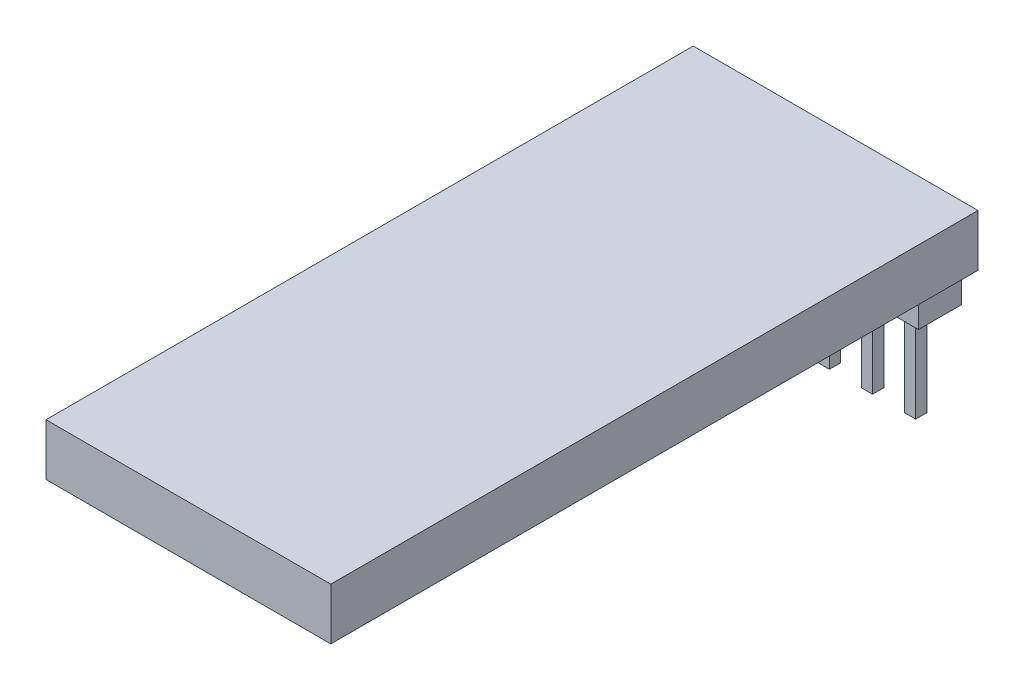
ISO-10303-21;
HEADER;
FILE_DESCRIPTION(('STEP AP214'),'2;1');
FILE_NAME('part.step','',(''),(''),'','','');
FILE_SCHEMA(('AUTOMOTIVE_DESIGN { 1 0 10303 214 1 1 1 1 }'));
ENDSEC;
DATA;
#1=APPLICATION_CONTEXT('core data for automotive mechanical design processes');
#2=APPLICATION_PROTOCOL_DEFINITION('international standard','automotive_design',2000,#1);
#3=PRODUCT_CONTEXT('',#1,'mechanical');
#4=PRODUCT('Part','Part','',(#3));
#5=PRODUCT_RELATED_PRODUCT_CATEGORY('part','',(#4));
#6=PRODUCT_DEFINITION_FORMATION('','',#4);
#7=PRODUCT_DEFINITION_CONTEXT('part definition',#1,'design');
#8=PRODUCT_DEFINITION('design','',#6,#7);
#9=PRODUCT_DEFINITION_SHAPE('','',#8);
#10=(LENGTH_UNIT() NAMED_UNIT(*) SI_UNIT(.MILLI.,.METRE.));
#11=(NAMED_UNIT(*) PLANE_ANGLE_UNIT() SI_UNIT($,.RADIAN.));
#12=(NAMED_UNIT(*) SI_UNIT($,.STERADIAN.) SOLID_ANGLE_UNIT());
#13=UNCERTAINTY_MEASURE_WITH_UNIT(LENGTH_MEASURE(1.E-05),#10,'distance_accuracy_value','');
#14=(GEOMETRIC_REPRESENTATION_CONTEXT(3) GLOBAL_UNCERTAINTY_ASSIGNED_CONTEXT((#13)) GLOBAL_UNIT_ASSIGNED_CONTEXT((#10,
#11,#12)) REPRESENTATION_CONTEXT('',''));
#15=CARTESIAN_POINT('',(0.,0.,0.));
#16=DIRECTION('',(0.,0.,1.));
#17=DIRECTION('',(1.,0.,0.));
#18=AXIS2_PLACEMENT_3D('',#15,#16,#17);
#19=CARTESIAN_POINT('',(0.765,-6.25,-17.3));
#20=DIRECTION('',(-1.,0.,0.));
#21=DIRECTION('',(0.,0.,1.));
#22=AXIS2_PLACEMENT_3D('',#19,#20,#21);
#23=PLANE('',#22);
#24=DIRECTION('',(0.,0.,-1.));
#25=VECTOR('',#24,1.);
#26=CARTESIAN_POINT('',(0.765,-3.5,-16.975));
#27=LINE('',#26,#25);
#28=CARTESIAN_POINT('',(0.765,-3.5,-16.975));
#29=VERTEX_POINT('',#28);
#30=CARTESIAN_POINT('',(0.765,-3.5,-17.625));
#31=VERTEX_POINT('',#30);
#32=EDGE_CURVE('P0_E252',#29,#31,#27,.T.);
#33=ORIENTED_EDGE('',*,*,#32,.T.);
#34=DIRECTION('',(0.,-1.,0.));
#35=VECTOR('',#34,1.);
#36=CARTESIAN_POINT('',(0.765,-3.5,-17.625));
#37=LINE('',#36,#35);
#38=CARTESIAN_POINT('',(0.765,-9.,-17.625));
#39=VERTEX_POINT('',#38);
#40=EDGE_CURVE('P0_E76',#31,#39,#37,.T.);
#41=ORIENTED_EDGE('',*,*,#40,.T.);
#42=DIRECTION('',(0.,0.,-1.));
#43=VECTOR('',#42,1.);
#44=CARTESIAN_POINT('',(0.765,-9.,-16.975));
#45=LINE('',#44,#43);
#46=CARTESIAN_POINT('',(0.765,-9.,-16.975));
#47=VERTEX_POINT('',#46);
#48=EDGE_CURVE('P0_E80',#47,#39,#45,.T.);
#49=ORIENTED_EDGE('',*,*,#48,.F.);
#50=DIRECTION('',(0.,-1.,0.));
#51=VECTOR('',#50,1.);
#52=CARTESIAN_POINT('',(0.765,-3.5,-16.975));
#53=LINE('',#52,#51);
#54=EDGE_CURVE('P0_E11',#29,#47,#53,.T.);
#55=ORIENTED_EDGE('',*,*,#54,.F.);
#56=EDGE_LOOP('',(#33,#41,#49,#55));
#57=FACE_BOUND('',#56,.T.);
#58=ADVANCED_FACE('P0_F16',(#57),#23,.T.);
#59=CARTESIAN_POINT('',(1.09,-6.25,-16.975));
#60=DIRECTION('',(0.,0.,1.));
#61=DIRECTION('',(1.,0.,0.));
#62=AXIS2_PLACEMENT_3D('',#59,#60,#61);
#63=PLANE('',#62);
#64=DIRECTION('',(-1.,0.,0.));
#65=VECTOR('',#64,1.);
#66=CARTESIAN_POINT('',(1.415,-3.5,-16.975));
#67=LINE('',#66,#65);
#68=CARTESIAN_POINT('',(1.415,-3.5,-16.975));
#69=VERTEX_POINT('',#68);
#70=EDGE_CURVE('P0_E247',#69,#29,#67,.T.);
#71=ORIENTED_EDGE('',*,*,#70,.T.);
#72=ORIENTED_EDGE('',*,*,#54,.T.);
#73=DIRECTION('',(-1.,0.,0.));
#74=VECTOR('',#73,1.);
#75=CARTESIAN_POINT('',(1.415,-9.,-16.975));
#76=LINE('',#75,#74);
#77=CARTESIAN_POINT('',(1.415,-9.,-16.975));
#78=VERTEX_POINT('',#77);
#79=EDGE_CURVE('P0_E84',#78,#47,#76,.T.);
#80=ORIENTED_EDGE('',*,*,#79,.F.);
#81=DIRECTION('',(0.,-1.,0.));
#82=VECTOR('',#81,1.);
#83=CARTESIAN_POINT('',(1.415,-3.5,-16.975));
#84=LINE('',#83,#82);
#85=EDGE_CURVE('P0_E20',#69,#78,#84,.T.);
#86=ORIENTED_EDGE('',*,*,#85,.F.);
#87=EDGE_LOOP('',(#71,#72,#80,#86));
#88=FACE_BOUND('',#87,.T.);
#89=ADVANCED_FACE('P0_F18',(#88),#63,.T.);
#90=CARTESIAN_POINT('',(1.415,-6.25,-17.3));
#91=DIRECTION('',(1.,0.,0.));
#92=DIRECTION('',(0.,1.,0.));
#93=AXIS2_PLACEMENT_3D('',#90,#91,#92);
#94=PLANE('',#93);
#95=DIRECTION('',(0.,0.,1.));
#96=VECTOR('',#95,1.);
#97=CARTESIAN_POINT('',(1.415,-3.5,-17.625));
#98=LINE('',#97,#96);
#99=CARTESIAN_POINT('',(1.415,-3.5,-17.625));
#100=VERTEX_POINT('',#99);
#101=EDGE_CURVE('P0_E94',#100,#69,#98,.T.);
#102=ORIENTED_EDGE('',*,*,#101,.T.);
#103=ORIENTED_EDGE('',*,*,#85,.T.);
#104=DIRECTION('',(0.,0.,1.));
#105=VECTOR('',#104,1.);
#106=CARTESIAN_POINT('',(1.415,-9.,-17.625));
#107=LINE('',#106,#105);
#108=CARTESIAN_POINT('',(1.415,-9.,-17.625));
#109=VERTEX_POINT('',#108);
#110=EDGE_CURVE('P0_E79',#109,#78,#107,.T.);
#111=ORIENTED_EDGE('',*,*,#110,.F.);
#112=DIRECTION('',(0.,-1.,0.));
#113=VECTOR('',#112,1.);
#114=CARTESIAN_POINT('',(1.415,-3.5,-17.625));
#115=LINE('',#114,#113);
#116=EDGE_CURVE('P0_E65',#100,#109,#115,.T.);
#117=ORIENTED_EDGE('',*,*,#116,.F.);
#118=EDGE_LOOP('',(#102,#103,#111,#117));
#119=FACE_BOUND('',#118,.T.);
#120=ADVANCED_FACE('P0_F81',(#119),#94,.T.);
#121=CARTESIAN_POINT('',(1.09,-6.25,-17.625));
#122=DIRECTION('',(0.,0.,-1.));
#123=DIRECTION('',(0.,-1.,0.));
#124=AXIS2_PLACEMENT_3D('',#121,#122,#123);
#125=PLANE('',#124);
#126=DIRECTION('',(1.,0.,0.));
#127=VECTOR('',#126,1.);
#128=CARTESIAN_POINT('',(0.765,-3.5,-17.625));
#129=LINE('',#128,#127);
#130=EDGE_CURVE('P0_E75',#31,#100,#129,.T.);
#131=ORIENTED_EDGE('',*,*,#130,.T.);
#132=ORIENTED_EDGE('',*,*,#116,.T.);
#133=DIRECTION('',(1.,0.,0.));
#134=VECTOR('',#133,1.);
#135=CARTESIAN_POINT('',(0.765,-9.,-17.625));
#136=LINE('',#135,#134);
#137=EDGE_CURVE('P0_E67',#39,#109,#136,.T.);
#138=ORIENTED_EDGE('',*,*,#137,.F.);
#139=ORIENTED_EDGE('',*,*,#40,.F.);
#140=EDGE_LOOP('',(#131,#132,#138,#139));
#141=FACE_BOUND('',#140,.T.);
#142=ADVANCED_FACE('P0_F70',(#141),#125,.T.);
#143=CARTESIAN_POINT('',(1.09,-9.,-17.3));
#144=DIRECTION('',(0.,-1.,0.));
#145=DIRECTION('',(0.,0.,-1.));
#146=AXIS2_PLACEMENT_3D('',#143,#144,#145);
#147=PLANE('',#146);
#148=ORIENTED_EDGE('',*,*,#137,.T.);
#149=ORIENTED_EDGE('',*,*,#110,.T.);
#150=ORIENTED_EDGE('',*,*,#79,.T.);
#151=ORIENTED_EDGE('',*,*,#48,.T.);
#152=EDGE_LOOP('',(#148,#149,#150,#151));
#153=FACE_BOUND('',#152,.T.);
#154=ADVANCED_FACE('P0_F86',(#153),#147,.T.);
#155=CARTESIAN_POINT('',(1.09,-3.5,-17.3));
#156=DIRECTION('',(0.,-1.,0.));
#157=DIRECTION('',(0.,0.,-1.));
#158=AXIS2_PLACEMENT_3D('',#155,#156,#157);
#159=PLANE('',#158);
#160=ORIENTED_EDGE('',*,*,#32,.F.);
#161=ORIENTED_EDGE('',*,*,#70,.F.);
#162=ORIENTED_EDGE('',*,*,#101,.F.);
#163=ORIENTED_EDGE('',*,*,#130,.F.);
#164=EDGE_LOOP('',(#160,#161,#162,#163));
#165=FACE_BOUND('',#164,.T.);
#166=ADVANCED_FACE('P0_F122',(#165),#159,.F.);
#167=CLOSED_SHELL('',(#58,#89,#120,#142,#154,#166));
#168=MANIFOLD_SOLID_BREP('P0_B1',#167);
#169=CARTESIAN_POINT('',(-6.735,-6.25,-17.3));
#170=DIRECTION('',(-1.,0.,0.));
#171=DIRECTION('',(0.,0.,1.));
#172=AXIS2_PLACEMENT_3D('',#169,#170,#171);
#173=PLANE('',#172);
#174=DIRECTION('',(0.,0.,-1.));
#175=VECTOR('',#174,1.);
#176=CARTESIAN_POINT('',(-6.735,-3.5,-16.975));
#177=LINE('',#176,#175);
#178=CARTESIAN_POINT('',(-6.735,-3.5,-16.975));
#179=VERTEX_POINT('',#178);
#180=CARTESIAN_POINT('',(-6.735,-3.5,-17.625));
#181=VERTEX_POINT('',#180);
#182=EDGE_CURVE('P1_E169',#179,#181,#177,.T.);
#183=ORIENTED_EDGE('',*,*,#182,.T.);
#184=DIRECTION('',(0.,-1.,0.));
#185=VECTOR('',#184,1.);
#186=CARTESIAN_POINT('',(-6.735,-3.5,-17.625));
#187=LINE('',#186,#185);
#188=CARTESIAN_POINT('',(-6.735,-9.,-17.625));
#189=VERTEX_POINT('',#188);
#190=EDGE_CURVE('P1_E71',#181,#189,#187,.T.);
#191=ORIENTED_EDGE('',*,*,#190,.T.);
#192=DIRECTION('',(0.,0.,-1.));
#193=VECTOR('',#192,1.);
#194=CARTESIAN_POINT('',(-6.735,-9.,-16.975));
#195=LINE('',#194,#193);
#196=CARTESIAN_POINT('',(-6.735,-9.,-16.975));
#197=VERTEX_POINT('',#196);
#198=EDGE_CURVE('P1_E73',#197,#189,#195,.T.);
#199=ORIENTED_EDGE('',*,*,#198,.F.);
#200=DIRECTION('',(0.,-1.,0.));
#201=VECTOR('',#200,1.);
#202=CARTESIAN_POINT('',(-6.735,-3.5,-16.975));
#203=LINE('',#202,#201);
#204=EDGE_CURVE('P1_E11',#179,#197,#203,.T.);
#205=ORIENTED_EDGE('',*,*,#204,.F.);
#206=EDGE_LOOP('',(#183,#191,#199,#205));
#207=FACE_BOUND('',#206,.T.);
#208=ADVANCED_FACE('P1_F16',(#207),#173,.T.);
#209=CARTESIAN_POINT('',(-6.41,-6.25,-16.975));
#210=DIRECTION('',(0.,0.,1.));
#211=DIRECTION('',(1.,0.,0.));
#212=AXIS2_PLACEMENT_3D('',#209,#210,#211);
#213=PLANE('',#212);
#214=DIRECTION('',(-1.,0.,0.));
#215=VECTOR('',#214,1.);
#216=CARTESIAN_POINT('',(-6.085,-3.5,-16.975));
#217=LINE('',#216,#215);
#218=CARTESIAN_POINT('',(-6.085,-3.5,-16.975));
#219=VERTEX_POINT('',#218);
#220=EDGE_CURVE('P1_E168',#219,#179,#217,.T.);
#221=ORIENTED_EDGE('',*,*,#220,.T.);
#222=ORIENTED_EDGE('',*,*,#204,.T.);
#223=DIRECTION('',(-1.,0.,0.));
#224=VECTOR('',#223,1.);
#225=CARTESIAN_POINT('',(-6.085,-9.,-16.975));
#226=LINE('',#225,#224);
#227=CARTESIAN_POINT('',(-6.085,-9.,-16.975));
#228=VERTEX_POINT('',#227);
#229=EDGE_CURVE('P1_E81',#228,#197,#226,.T.);
#230=ORIENTED_EDGE('',*,*,#229,.F.);
#231=DIRECTION('',(0.,-1.,0.));
#232=VECTOR('',#231,1.);
#233=CARTESIAN_POINT('',(-6.085,-3.5,-16.975));
#234=LINE('',#233,#232);
#235=EDGE_CURVE('P1_E25',#219,#228,#234,.T.);
#236=ORIENTED_EDGE('',*,*,#235,.F.);
#237=EDGE_LOOP('',(#221,#222,#230,#236));
#238=FACE_BOUND('',#237,.T.);
#239=ADVANCED_FACE('P1_F139',(#238),#213,.T.);
#240=CARTESIAN_POINT('',(-6.085,-6.25,-17.3));
#241=DIRECTION('',(1.,0.,0.));
#242=DIRECTION('',(0.,1.,0.));
#243=AXIS2_PLACEMENT_3D('',#240,#241,#242);
#244=PLANE('',#243);
#245=DIRECTION('',(0.,0.,1.));
#246=VECTOR('',#245,1.);
#247=CARTESIAN_POINT('',(-6.085,-3.5,-17.625));
#248=LINE('',#247,#246);
#249=CARTESIAN_POINT('',(-6.085,-3.5,-17.625));
#250=VERTEX_POINT('',#249);
#251=EDGE_CURVE('P1_E90',#250,#219,#248,.T.);
#252=ORIENTED_EDGE('',*,*,#251,.T.);
#253=ORIENTED_EDGE('',*,*,#235,.T.);
#254=DIRECTION('',(0.,0.,1.));
#255=VECTOR('',#254,1.);
#256=CARTESIAN_POINT('',(-6.085,-9.,-17.625));
#257=LINE('',#256,#255);
#258=CARTESIAN_POINT('',(-6.085,-9.,-17.625));
#259=VERTEX_POINT('',#258);
#260=EDGE_CURVE('P1_E76',#259,#228,#257,.T.);
#261=ORIENTED_EDGE('',*,*,#260,.F.);
#262=DIRECTION('',(0.,-1.,0.));
#263=VECTOR('',#262,1.);
#264=CARTESIAN_POINT('',(-6.085,-3.5,-17.625));
#265=LINE('',#264,#263);
#266=EDGE_CURVE('P1_E58',#250,#259,#265,.T.);
#267=ORIENTED_EDGE('',*,*,#266,.F.);
#268=EDGE_LOOP('',(#252,#253,#261,#267));
#269=FACE_BOUND('',#268,.T.);
#270=ADVANCED_FACE('P1_F80',(#269),#244,.T.);
#271=CARTESIAN_POINT('',(-6.41,-6.25,-17.625));
#272=DIRECTION('',(0.,0.,-1.));
#273=DIRECTION('',(0.,-1.,0.));
#274=AXIS2_PLACEMENT_3D('',#271,#272,#273);
#275=PLANE('',#274);
#276=DIRECTION('',(1.,0.,0.));
#277=VECTOR('',#276,1.);
#278=CARTESIAN_POINT('',(-6.735,-3.5,-17.625));
#279=LINE('',#278,#277);
#280=EDGE_CURVE('P1_E70',#181,#250,#279,.T.);
#281=ORIENTED_EDGE('',*,*,#280,.T.);
#282=ORIENTED_EDGE('',*,*,#266,.T.);
#283=DIRECTION('',(1.,0.,0.));
#284=VECTOR('',#283,1.);
#285=CARTESIAN_POINT('',(-6.735,-9.,-17.625));
#286=LINE('',#285,#284);
#287=EDGE_CURVE('P1_E65',#189,#259,#286,.T.);
#288=ORIENTED_EDGE('',*,*,#287,.F.);
#289=ORIENTED_EDGE('',*,*,#190,.F.);
#290=EDGE_LOOP('',(#281,#282,#288,#289));
#291=FACE_BOUND('',#290,.T.);
#292=ADVANCED_FACE('P1_F62',(#291),#275,.T.);
#293=CARTESIAN_POINT('',(-6.41,-9.,-17.3));
#294=DIRECTION('',(0.,-1.,0.));
#295=DIRECTION('',(0.,0.,-1.));
#296=AXIS2_PLACEMENT_3D('',#293,#294,#295);
#297=PLANE('',#296);
#298=ORIENTED_EDGE('',*,*,#287,.T.);
#299=ORIENTED_EDGE('',*,*,#260,.T.);
#300=ORIENTED_EDGE('',*,*,#229,.T.);
#301=ORIENTED_EDGE('',*,*,#198,.T.);
#302=EDGE_LOOP('',(#298,#299,#300,#301));
#303=FACE_BOUND('',#302,.T.);
#304=ADVANCED_FACE('P1_F82',(#303),#297,.T.);
#305=CARTESIAN_POINT('',(-6.41,-3.5,-17.3));
#306=DIRECTION('',(0.,-1.,0.));
#307=DIRECTION('',(0.,0.,-1.));
#308=AXIS2_PLACEMENT_3D('',#305,#306,#307);
#309=PLANE('',#308);
#310=ORIENTED_EDGE('',*,*,#182,.F.);
#311=ORIENTED_EDGE('',*,*,#220,.F.);
#312=ORIENTED_EDGE('',*,*,#251,.F.);
#313=ORIENTED_EDGE('',*,*,#280,.F.);
#314=EDGE_LOOP('',(#310,#311,#312,#313));
#315=FACE_BOUND('',#314,.T.);
#316=ADVANCED_FACE('P1_F103',(#315),#309,.F.);
#317=CLOSED_SHELL('',(#208,#239,#270,#292,#304,#316));
#318=MANIFOLD_SOLID_BREP('P1_B1',#317);
#319=CARTESIAN_POINT('',(-1.735,-6.25,-17.3));
#320=DIRECTION('',(-1.,0.,0.));
#321=DIRECTION('',(0.,0.,1.));
#322=AXIS2_PLACEMENT_3D('',#319,#320,#321);
#323=PLANE('',#322);
#324=DIRECTION('',(0.,0.,-1.));
#325=VECTOR('',#324,1.);
#326=CARTESIAN_POINT('',(-1.735,-3.5,-16.975));
#327=LINE('',#326,#325);
#328=CARTESIAN_POINT('',(-1.735,-3.5,-16.975));
#329=VERTEX_POINT('',#328);
#330=CARTESIAN_POINT('',(-1.735,-3.5,-17.625));
#331=VERTEX_POINT('',#330);
#332=EDGE_CURVE('P2_E249',#329,#331,#327,.T.);
#333=ORIENTED_EDGE('',*,*,#332,.T.);
#334=DIRECTION('',(0.,-1.,0.));
#335=VECTOR('',#334,1.);
#336=CARTESIAN_POINT('',(-1.735,-3.5,-17.625));
#337=LINE('',#336,#335);
#338=CARTESIAN_POINT('',(-1.735,-9.,-17.625));
#339=VERTEX_POINT('',#338);
#340=EDGE_CURVE('P2_E63',#331,#339,#337,.T.);
#341=ORIENTED_EDGE('',*,*,#340,.T.);
#342=DIRECTION('',(0.,0.,-1.));
#343=VECTOR('',#342,1.);
#344=CARTESIAN_POINT('',(-1.735,-9.,-16.975));
#345=LINE('',#344,#343);
#346=CARTESIAN_POINT('',(-1.735,-9.,-16.975));
#347=VERTEX_POINT('',#346);
#348=EDGE_CURVE('P2_E83',#347,#339,#345,.T.);
#349=ORIENTED_EDGE('',*,*,#348,.F.);
#350=DIRECTION('',(0.,-1.,0.));
#351=VECTOR('',#350,1.);
#352=CARTESIAN_POINT('',(-1.735,-3.5,-16.975));
#353=LINE('',#352,#351);
#354=EDGE_CURVE('P2_E11',#329,#347,#353,.T.);
#355=ORIENTED_EDGE('',*,*,#354,.F.);
#356=EDGE_LOOP('',(#333,#341,#349,#355));
#357=FACE_BOUND('',#356,.T.);
#358=ADVANCED_FACE('P2_F16',(#357),#323,.T.);
#359=CARTESIAN_POINT('',(-1.41,-6.25,-16.975));
#360=DIRECTION('',(0.,0.,1.));
#361=DIRECTION('',(1.,0.,0.));
#362=AXIS2_PLACEMENT_3D('',#359,#360,#361);
#363=PLANE('',#362);
#364=DIRECTION('',(-1.,0.,0.));
#365=VECTOR('',#364,1.);
#366=CARTESIAN_POINT('',(-1.085,-3.5,-16.975));
#367=LINE('',#366,#365);
#368=CARTESIAN_POINT('',(-1.085,-3.5,-16.975));
#369=VERTEX_POINT('',#368);
#370=EDGE_CURVE('P2_E250',#369,#329,#367,.T.);
#371=ORIENTED_EDGE('',*,*,#370,.T.);
#372=ORIENTED_EDGE('',*,*,#354,.T.);
#373=DIRECTION('',(-1.,0.,0.));
#374=VECTOR('',#373,1.);
#375=CARTESIAN_POINT('',(-1.085,-9.,-16.975));
#376=LINE('',#375,#374);
#377=CARTESIAN_POINT('',(-1.085,-9.,-16.975));
#378=VERTEX_POINT('',#377);
#379=EDGE_CURVE('P2_E93',#378,#347,#376,.T.);
#380=ORIENTED_EDGE('',*,*,#379,.F.);
#381=DIRECTION('',(0.,-1.,0.));
#382=VECTOR('',#381,1.);
#383=CARTESIAN_POINT('',(-1.085,-3.5,-16.975));
#384=LINE('',#383,#382);
#385=EDGE_CURVE('P2_E20',#369,#378,#384,.T.);
#386=ORIENTED_EDGE('',*,*,#385,.F.);
#387=EDGE_LOOP('',(#371,#372,#380,#386));
#388=FACE_BOUND('',#387,.T.);
#389=ADVANCED_FACE('P2_F18',(#388),#363,.T.);
#390=CARTESIAN_POINT('',(-1.085,-6.25,-17.3));
#391=DIRECTION('',(1.,0.,0.));
#392=DIRECTION('',(0.,1.,0.));
#393=AXIS2_PLACEMENT_3D('',#390,#391,#392);
#394=PLANE('',#393);
#395=DIRECTION('',(0.,0.,1.));
#396=VECTOR('',#395,1.);
#397=CARTESIAN_POINT('',(-1.085,-3.5,-17.625));
#398=LINE('',#397,#396);
#399=CARTESIAN_POINT('',(-1.085,-3.5,-17.625));
#400=VERTEX_POINT('',#399);
#401=EDGE_CURVE('P2_E99',#400,#369,#398,.T.);
#402=ORIENTED_EDGE('',*,*,#401,.T.);
#403=ORIENTED_EDGE('',*,*,#385,.T.);
#404=DIRECTION('',(0.,0.,1.));
#405=VECTOR('',#404,1.);
#406=CARTESIAN_POINT('',(-1.085,-9.,-17.625));
#407=LINE('',#406,#405);
#408=CARTESIAN_POINT('',(-1.085,-9.,-17.625));
#409=VERTEX_POINT('',#408);
#410=EDGE_CURVE('P2_E88',#409,#378,#407,.T.);
#411=ORIENTED_EDGE('',*,*,#410,.F.);
#412=DIRECTION('',(0.,-1.,0.));
#413=VECTOR('',#412,1.);
#414=CARTESIAN_POINT('',(-1.085,-3.5,-17.625));
#415=LINE('',#414,#413);
#416=EDGE_CURVE('P2_E71',#400,#409,#415,.T.);
#417=ORIENTED_EDGE('',*,*,#416,.F.);
#418=EDGE_LOOP('',(#402,#403,#411,#417));
#419=FACE_BOUND('',#418,.T.);
#420=ADVANCED_FACE('P2_F87',(#419),#394,.T.);
#421=CARTESIAN_POINT('',(-1.41,-6.25,-17.625));
#422=DIRECTION('',(0.,0.,-1.));
#423=DIRECTION('',(0.,-1.,0.));
#424=AXIS2_PLACEMENT_3D('',#421,#422,#423);
#425=PLANE('',#424);
#426=DIRECTION('',(1.,0.,0.));
#427=VECTOR('',#426,1.);
#428=CARTESIAN_POINT('',(-1.735,-3.5,-17.625));
#429=LINE('',#428,#427);
#430=EDGE_CURVE('P2_E77',#331,#400,#429,.T.);
#431=ORIENTED_EDGE('',*,*,#430,.T.);
#432=ORIENTED_EDGE('',*,*,#416,.T.);
#433=DIRECTION('',(1.,0.,0.));
#434=VECTOR('',#433,1.);
#435=CARTESIAN_POINT('',(-1.735,-9.,-17.625));
#436=LINE('',#435,#434);
#437=EDGE_CURVE('P2_E76',#339,#409,#436,.T.);
#438=ORIENTED_EDGE('',*,*,#437,.F.);
#439=ORIENTED_EDGE('',*,*,#340,.F.);
#440=EDGE_LOOP('',(#431,#432,#438,#439));
#441=FACE_BOUND('',#440,.T.);
#442=ADVANCED_FACE('P2_F72',(#441),#425,.T.);
#443=CARTESIAN_POINT('',(-1.41,-9.,-17.3));
#444=DIRECTION('',(0.,-1.,0.));
#445=DIRECTION('',(0.,0.,-1.));
#446=AXIS2_PLACEMENT_3D('',#443,#444,#445);
#447=PLANE('',#446);
#448=ORIENTED_EDGE('',*,*,#437,.T.);
#449=ORIENTED_EDGE('',*,*,#410,.T.);
#450=ORIENTED_EDGE('',*,*,#379,.T.);
#451=ORIENTED_EDGE('',*,*,#348,.T.);
#452=EDGE_LOOP('',(#448,#449,#450,#451));
#453=FACE_BOUND('',#452,.T.);
#454=ADVANCED_FACE('P2_F91',(#453),#447,.T.);
#455=CARTESIAN_POINT('',(-1.41,-3.5,-17.3));
#456=DIRECTION('',(0.,-1.,0.));
#457=DIRECTION('',(0.,0.,-1.));
#458=AXIS2_PLACEMENT_3D('',#455,#456,#457);
#459=PLANE('',#458);
#460=ORIENTED_EDGE('',*,*,#332,.F.);
#461=ORIENTED_EDGE('',*,*,#370,.F.);
#462=ORIENTED_EDGE('',*,*,#401,.F.);
#463=ORIENTED_EDGE('',*,*,#430,.F.);
#464=EDGE_LOOP('',(#460,#461,#462,#463));
#465=FACE_BOUND('',#464,.T.);
#466=ADVANCED_FACE('P2_F112',(#465),#459,.F.);
#467=CLOSED_SHELL('',(#358,#389,#420,#442,#454,#466));
#468=MANIFOLD_SOLID_BREP('P2_B1',#467);
#469=CARTESIAN_POINT('',(-4.235,-6.25,-17.3));
#470=DIRECTION('',(-1.,0.,0.));
#471=DIRECTION('',(0.,0.,1.));
#472=AXIS2_PLACEMENT_3D('',#469,#470,#471);
#473=PLANE('',#472);
#474=DIRECTION('',(0.,0.,-1.));
#475=VECTOR('',#474,1.);
#476=CARTESIAN_POINT('',(-4.235,-3.5,-16.975));
#477=LINE('',#476,#475);
#478=CARTESIAN_POINT('',(-4.235,-3.5,-16.975));
#479=VERTEX_POINT('',#478);
#480=CARTESIAN_POINT('',(-4.235,-3.5,-17.625));
#481=VERTEX_POINT('',#480);
#482=EDGE_CURVE('P3_E100',#479,#481,#477,.T.);
#483=ORIENTED_EDGE('',*,*,#482,.T.);
#484=DIRECTION('',(0.,-1.,0.));
#485=VECTOR('',#484,1.);
#486=CARTESIAN_POINT('',(-4.235,-3.5,-17.625));
#487=LINE('',#486,#485);
#488=CARTESIAN_POINT('',(-4.235,-9.,-17.625));
#489=VERTEX_POINT('',#488);
#490=EDGE_CURVE('P3_E78',#481,#489,#487,.T.);
#491=ORIENTED_EDGE('',*,*,#490,.T.);
#492=DIRECTION('',(0.,0.,-1.));
#493=VECTOR('',#492,1.);
#494=CARTESIAN_POINT('',(-4.235,-9.,-16.975));
#495=LINE('',#494,#493);
#496=CARTESIAN_POINT('',(-4.235,-9.,-16.975));
#497=VERTEX_POINT('',#496);
#498=EDGE_CURVE('P3_E79',#497,#489,#495,.T.);
#499=ORIENTED_EDGE('',*,*,#498,.F.);
#500=DIRECTION('',(0.,-1.,0.));
#501=VECTOR('',#500,1.);
#502=CARTESIAN_POINT('',(-4.235,-3.5,-16.975));
#503=LINE('',#502,#501);
#504=EDGE_CURVE('P3_E11',#479,#497,#503,.T.);
#505=ORIENTED_EDGE('',*,*,#504,.F.);
#506=EDGE_LOOP('',(#483,#491,#499,#505));
#507=FACE_BOUND('',#506,.T.);
#508=ADVANCED_FACE('P3_F16',(#507),#473,.T.);
#509=CARTESIAN_POINT('',(-3.91,-6.25,-16.975));
#510=DIRECTION('',(0.,0.,1.));
#511=DIRECTION('',(1.,0.,0.));
#512=AXIS2_PLACEMENT_3D('',#509,#510,#511);
#513=PLANE('',#512);
#514=DIRECTION('',(-1.,0.,0.));
#515=VECTOR('',#514,1.);
#516=CARTESIAN_POINT('',(-3.585,-3.5,-16.975));
#517=LINE('',#516,#515);
#518=CARTESIAN_POINT('',(-3.585,-3.5,-16.975));
#519=VERTEX_POINT('',#518);
#520=EDGE_CURVE('P3_E95',#519,#479,#517,.T.);
#521=ORIENTED_EDGE('',*,*,#520,.T.);
#522=ORIENTED_EDGE('',*,*,#504,.T.);
#523=DIRECTION('',(-1.,0.,0.));
#524=VECTOR('',#523,1.);
#525=CARTESIAN_POINT('',(-3.585,-9.,-16.975));
#526=LINE('',#525,#524);
#527=CARTESIAN_POINT('',(-3.585,-9.,-16.975));
#528=VERTEX_POINT('',#527);
#529=EDGE_CURVE('P3_E104',#528,#497,#526,.T.);
#530=ORIENTED_EDGE('',*,*,#529,.F.);
#531=DIRECTION('',(0.,-1.,0.));
#532=VECTOR('',#531,1.);
#533=CARTESIAN_POINT('',(-3.585,-3.5,-16.975));
#534=LINE('',#533,#532);
#535=EDGE_CURVE('P3_E25',#519,#528,#534,.T.);
#536=ORIENTED_EDGE('',*,*,#535,.F.);
#537=EDGE_LOOP('',(#521,#522,#530,#536));
#538=FACE_BOUND('',#537,.T.);
#539=ADVANCED_FACE('P3_F18',(#538),#513,.T.);
#540=CARTESIAN_POINT('',(-3.585,-6.25,-17.3));
#541=DIRECTION('',(1.,0.,0.));
#542=DIRECTION('',(0.,1.,0.));
#543=AXIS2_PLACEMENT_3D('',#540,#541,#542);
#544=PLANE('',#543);
#545=DIRECTION('',(0.,0.,1.));
#546=VECTOR('',#545,1.);
#547=CARTESIAN_POINT('',(-3.585,-3.5,-17.625));
#548=LINE('',#547,#546);
#549=CARTESIAN_POINT('',(-3.585,-3.5,-17.625));
#550=VERTEX_POINT('',#549);
#551=EDGE_CURVE('P3_E75',#550,#519,#548,.T.);
#552=ORIENTED_EDGE('',*,*,#551,.T.);
#553=ORIENTED_EDGE('',*,*,#535,.T.);
#554=DIRECTION('',(0.,0.,1.));
#555=VECTOR('',#554,1.);
#556=CARTESIAN_POINT('',(-3.585,-9.,-17.625));
#557=LINE('',#556,#555);
#558=CARTESIAN_POINT('',(-3.585,-9.,-17.625));
#559=VERTEX_POINT('',#558);
#560=EDGE_CURVE('P3_E72',#559,#528,#557,.T.);
#561=ORIENTED_EDGE('',*,*,#560,.F.);
#562=DIRECTION('',(0.,-1.,0.));
#563=VECTOR('',#562,1.);
#564=CARTESIAN_POINT('',(-3.585,-3.5,-17.625));
#565=LINE('',#564,#563);
#566=EDGE_CURVE('P3_E70',#550,#559,#565,.T.);
#567=ORIENTED_EDGE('',*,*,#566,.F.);
#568=EDGE_LOOP('',(#552,#553,#561,#567));
#569=FACE_BOUND('',#568,.T.);
#570=ADVANCED_FACE('P3_F67',(#569),#544,.T.);
#571=CARTESIAN_POINT('',(-3.91,-6.25,-17.625));
#572=DIRECTION('',(0.,0.,-1.));
#573=DIRECTION('',(0.,-1.,0.));
#574=AXIS2_PLACEMENT_3D('',#571,#572,#573);
#575=PLANE('',#574);
#576=DIRECTION('',(1.,0.,0.));
#577=VECTOR('',#576,1.);
#578=CARTESIAN_POINT('',(-4.235,-3.5,-17.625));
#579=LINE('',#578,#577);
#580=EDGE_CURVE('P3_E83',#481,#550,#579,.T.);
#581=ORIENTED_EDGE('',*,*,#580,.T.);
#582=ORIENTED_EDGE('',*,*,#566,.T.);
#583=DIRECTION('',(1.,0.,0.));
#584=VECTOR('',#583,1.);
#585=CARTESIAN_POINT('',(-4.235,-9.,-17.625));
#586=LINE('',#585,#584);
#587=EDGE_CURVE('P3_E90',#489,#559,#586,.T.);
#588=ORIENTED_EDGE('',*,*,#587,.F.);
#589=ORIENTED_EDGE('',*,*,#490,.F.);
#590=EDGE_LOOP('',(#581,#582,#588,#589));
#591=FACE_BOUND('',#590,.T.);
#592=ADVANCED_FACE('P3_F82',(#591),#575,.T.);
#593=CARTESIAN_POINT('',(-3.91,-9.,-17.3));
#594=DIRECTION('',(0.,-1.,0.));
#595=DIRECTION('',(0.,0.,-1.));
#596=AXIS2_PLACEMENT_3D('',#593,#594,#595);
#597=PLANE('',#596);
#598=ORIENTED_EDGE('',*,*,#587,.T.);
#599=ORIENTED_EDGE('',*,*,#560,.T.);
#600=ORIENTED_EDGE('',*,*,#529,.T.);
#601=ORIENTED_EDGE('',*,*,#498,.T.);
#602=EDGE_LOOP('',(#598,#599,#600,#601));
#603=FACE_BOUND('',#602,.T.);
#604=ADVANCED_FACE('P3_F124',(#603),#597,.T.);
#605=CARTESIAN_POINT('',(-3.91,-3.5,-17.3));
#606=DIRECTION('',(0.,-1.,0.));
#607=DIRECTION('',(0.,0.,-1.));
#608=AXIS2_PLACEMENT_3D('',#605,#606,#607);
#609=PLANE('',#608);
#610=ORIENTED_EDGE('',*,*,#482,.F.);
#611=ORIENTED_EDGE('',*,*,#520,.F.);
#612=ORIENTED_EDGE('',*,*,#551,.F.);
#613=ORIENTED_EDGE('',*,*,#580,.F.);
#614=EDGE_LOOP('',(#610,#611,#612,#613));
#615=FACE_BOUND('',#614,.T.);
#616=ADVANCED_FACE('P3_F93',(#615),#609,.F.);
#617=CLOSED_SHELL('',(#508,#539,#570,#592,#604,#616));
#618=MANIFOLD_SOLID_BREP('P3_B1',#617);
#619=CARTESIAN_POINT('',(5.765,-6.25,-17.3));
#620=DIRECTION('',(-1.,0.,0.));
#621=DIRECTION('',(0.,0.,1.));
#622=AXIS2_PLACEMENT_3D('',#619,#620,#621);
#623=PLANE('',#622);
#624=DIRECTION('',(0.,0.,-1.));
#625=VECTOR('',#624,1.);
#626=CARTESIAN_POINT('',(5.765,-3.5,-16.975));
#627=LINE('',#626,#625);
#628=CARTESIAN_POINT('',(5.765,-3.5,-16.975));
#629=VERTEX_POINT('',#628);
#630=CARTESIAN_POINT('',(5.765,-3.5,-17.625));
#631=VERTEX_POINT('',#630);
#632=EDGE_CURVE('P4_E119',#629,#631,#627,.T.);
#633=ORIENTED_EDGE('',*,*,#632,.T.);
#634=DIRECTION('',(0.,-1.,0.));
#635=VECTOR('',#634,1.);
#636=CARTESIAN_POINT('',(5.765,-3.5,-17.625));
#637=LINE('',#636,#635);
#638=CARTESIAN_POINT('',(5.765,-9.,-17.625));
#639=VERTEX_POINT('',#638);
#640=EDGE_CURVE('P4_E61',#631,#639,#637,.T.);
#641=ORIENTED_EDGE('',*,*,#640,.T.);
#642=DIRECTION('',(0.,0.,-1.));
#643=VECTOR('',#642,1.);
#644=CARTESIAN_POINT('',(5.765,-9.,-16.975));
#645=LINE('',#644,#643);
#646=CARTESIAN_POINT('',(5.765,-9.,-16.975));
#647=VERTEX_POINT('',#646);
#648=EDGE_CURVE('P4_E81',#647,#639,#645,.T.);
#649=ORIENTED_EDGE('',*,*,#648,.F.);
#650=DIRECTION('',(0.,-1.,0.));
#651=VECTOR('',#650,1.);
#652=CARTESIAN_POINT('',(5.765,-3.5,-16.975));
#653=LINE('',#652,#651);
#654=EDGE_CURVE('P4_E11',#629,#647,#653,.T.);
#655=ORIENTED_EDGE('',*,*,#654,.F.);
#656=EDGE_LOOP('',(#633,#641,#649,#655));
#657=FACE_BOUND('',#656,.T.);
#658=ADVANCED_FACE('P4_F16',(#657),#623,.T.);
#659=CARTESIAN_POINT('',(6.09,-6.25,-16.975));
#660=DIRECTION('',(0.,0.,1.));
#661=DIRECTION('',(1.,0.,0.));
#662=AXIS2_PLACEMENT_3D('',#659,#660,#661);
#663=PLANE('',#662);
#664=DIRECTION('',(-1.,0.,0.));
#665=VECTOR('',#664,1.);
#666=CARTESIAN_POINT('',(6.415,-3.5,-16.975));
#667=LINE('',#666,#665);
#668=CARTESIAN_POINT('',(6.415,-3.5,-16.975));
#669=VERTEX_POINT('',#668);
#670=EDGE_CURVE('P4_E108',#669,#629,#667,.T.);
#671=ORIENTED_EDGE('',*,*,#670,.T.);
#672=ORIENTED_EDGE('',*,*,#654,.T.);
#673=DIRECTION('',(-1.,0.,0.));
#674=VECTOR('',#673,1.);
#675=CARTESIAN_POINT('',(6.415,-9.,-16.975));
#676=LINE('',#675,#674);
#677=CARTESIAN_POINT('',(6.415,-9.,-16.975));
#678=VERTEX_POINT('',#677);
#679=EDGE_CURVE('P4_E90',#678,#647,#676,.T.);
#680=ORIENTED_EDGE('',*,*,#679,.F.);
#681=DIRECTION('',(0.,-1.,0.));
#682=VECTOR('',#681,1.);
#683=CARTESIAN_POINT('',(6.415,-3.5,-16.975));
#684=LINE('',#683,#682);
#685=EDGE_CURVE('P4_E27',#669,#678,#684,.T.);
#686=ORIENTED_EDGE('',*,*,#685,.F.);
#687=EDGE_LOOP('',(#671,#672,#680,#686));
#688=FACE_BOUND('',#687,.T.);
#689=ADVANCED_FACE('P4_F18',(#688),#663,.T.);
#690=CARTESIAN_POINT('',(6.415,-6.25,-17.3));
#691=DIRECTION('',(1.,0.,0.));
#692=DIRECTION('',(0.,1.,0.));
#693=AXIS2_PLACEMENT_3D('',#690,#691,#692);
#694=PLANE('',#693);
#695=DIRECTION('',(0.,0.,1.));
#696=VECTOR('',#695,1.);
#697=CARTESIAN_POINT('',(6.415,-3.5,-17.625));
#698=LINE('',#697,#696);
#699=CARTESIAN_POINT('',(6.415,-3.5,-17.625));
#700=VERTEX_POINT('',#699);
#701=EDGE_CURVE('P4_E100',#700,#669,#698,.T.);
#702=ORIENTED_EDGE('',*,*,#701,.T.);
#703=ORIENTED_EDGE('',*,*,#685,.T.);
#704=DIRECTION('',(0.,0.,1.));
#705=VECTOR('',#704,1.);
#706=CARTESIAN_POINT('',(6.415,-9.,-17.625));
#707=LINE('',#706,#705);
#708=CARTESIAN_POINT('',(6.415,-9.,-17.625));
#709=VERTEX_POINT('',#708);
#710=EDGE_CURVE('P4_E82',#709,#678,#707,.T.);
#711=ORIENTED_EDGE('',*,*,#710,.F.);
#712=DIRECTION('',(0.,-1.,0.));
#713=VECTOR('',#712,1.);
#714=CARTESIAN_POINT('',(6.415,-3.5,-17.625));
#715=LINE('',#714,#713);
#716=EDGE_CURVE('P4_E69',#700,#709,#715,.T.);
#717=ORIENTED_EDGE('',*,*,#716,.F.);
#718=EDGE_LOOP('',(#702,#703,#711,#717));
#719=FACE_BOUND('',#718,.T.);
#720=ADVANCED_FACE('P4_F84',(#719),#694,.T.);
#721=CARTESIAN_POINT('',(6.09,-6.25,-17.625));
#722=DIRECTION('',(0.,0.,-1.));
#723=DIRECTION('',(0.,-1.,0.));
#724=AXIS2_PLACEMENT_3D('',#721,#722,#723);
#725=PLANE('',#724);
#726=DIRECTION('',(1.,0.,0.));
#727=VECTOR('',#726,1.);
#728=CARTESIAN_POINT('',(5.765,-3.5,-17.625));
#729=LINE('',#728,#727);
#730=EDGE_CURVE('P4_E76',#631,#700,#729,.T.);
#731=ORIENTED_EDGE('',*,*,#730,.T.);
#732=ORIENTED_EDGE('',*,*,#716,.T.);
#733=DIRECTION('',(1.,0.,0.));
#734=VECTOR('',#733,1.);
#735=CARTESIAN_POINT('',(5.765,-9.,-17.625));
#736=LINE('',#735,#734);
#737=EDGE_CURVE('P4_E72',#639,#709,#736,.T.);
#738=ORIENTED_EDGE('',*,*,#737,.F.);
#739=ORIENTED_EDGE('',*,*,#640,.F.);
#740=EDGE_LOOP('',(#731,#732,#738,#739));
#741=FACE_BOUND('',#740,.T.);
#742=ADVANCED_FACE('P4_F71',(#741),#725,.T.);
#743=CARTESIAN_POINT('',(6.09,-9.,-17.3));
#744=DIRECTION('',(0.,-1.,0.));
#745=DIRECTION('',(0.,0.,-1.));
#746=AXIS2_PLACEMENT_3D('',#743,#744,#745);
#747=PLANE('',#746);
#748=ORIENTED_EDGE('',*,*,#737,.T.);
#749=ORIENTED_EDGE('',*,*,#710,.T.);
#750=ORIENTED_EDGE('',*,*,#679,.T.);
#751=ORIENTED_EDGE('',*,*,#648,.T.);
#752=EDGE_LOOP('',(#748,#749,#750,#751));
#753=FACE_BOUND('',#752,.T.);
#754=ADVANCED_FACE('P4_F93',(#753),#747,.T.);
#755=CARTESIAN_POINT('',(6.09,-3.5,-17.3));
#756=DIRECTION('',(0.,-1.,0.));
#757=DIRECTION('',(0.,0.,-1.));
#758=AXIS2_PLACEMENT_3D('',#755,#756,#757);
#759=PLANE('',#758);
#760=ORIENTED_EDGE('',*,*,#632,.F.);
#761=ORIENTED_EDGE('',*,*,#670,.F.);
#762=ORIENTED_EDGE('',*,*,#701,.F.);
#763=ORIENTED_EDGE('',*,*,#730,.F.);
#764=EDGE_LOOP('',(#760,#761,#762,#763));
#765=FACE_BOUND('',#764,.T.);
#766=ADVANCED_FACE('P4_F130',(#765),#759,.F.);
#767=CLOSED_SHELL('',(#658,#689,#720,#742,#754,#766));
#768=MANIFOLD_SOLID_BREP('P4_B1',#767);
#769=CARTESIAN_POINT('',(3.265,-6.25,-17.3));
#770=DIRECTION('',(-1.,0.,0.));
#771=DIRECTION('',(0.,0.,1.));
#772=AXIS2_PLACEMENT_3D('',#769,#770,#771);
#773=PLANE('',#772);
#774=DIRECTION('',(0.,0.,-1.));
#775=VECTOR('',#774,1.);
#776=CARTESIAN_POINT('',(3.265,-3.5,-16.975));
#777=LINE('',#776,#775);
#778=CARTESIAN_POINT('',(3.265,-3.5,-16.975));
#779=VERTEX_POINT('',#778);
#780=CARTESIAN_POINT('',(3.265,-3.5,-17.625));
#781=VERTEX_POINT('',#780);
#782=EDGE_CURVE('P5_E171',#779,#781,#777,.T.);
#783=ORIENTED_EDGE('',*,*,#782,.T.);
#784=DIRECTION('',(0.,-1.,0.));
#785=VECTOR('',#784,1.);
#786=CARTESIAN_POINT('',(3.265,-3.5,-17.625));
#787=LINE('',#786,#785);
#788=CARTESIAN_POINT('',(3.265,-9.,-17.625));
#789=VERTEX_POINT('',#788);
#790=EDGE_CURVE('P5_E74',#781,#789,#787,.T.);
#791=ORIENTED_EDGE('',*,*,#790,.T.);
#792=DIRECTION('',(0.,0.,-1.));
#793=VECTOR('',#792,1.);
#794=CARTESIAN_POINT('',(3.265,-9.,-16.975));
#795=LINE('',#794,#793);
#796=CARTESIAN_POINT('',(3.265,-9.,-16.975));
#797=VERTEX_POINT('',#796);
#798=EDGE_CURVE('P5_E76',#797,#789,#795,.T.);
#799=ORIENTED_EDGE('',*,*,#798,.F.);
#800=DIRECTION('',(0.,-1.,0.));
#801=VECTOR('',#800,1.);
#802=CARTESIAN_POINT('',(3.265,-3.5,-16.975));
#803=LINE('',#802,#801);
#804=EDGE_CURVE('P5_E11',#779,#797,#803,.T.);
#805=ORIENTED_EDGE('',*,*,#804,.F.);
#806=EDGE_LOOP('',(#783,#791,#799,#805));
#807=FACE_BOUND('',#806,.T.);
#808=ADVANCED_FACE('P5_F16',(#807),#773,.T.);
#809=CARTESIAN_POINT('',(3.59,-6.25,-16.975));
#810=DIRECTION('',(0.,0.,1.));
#811=DIRECTION('',(1.,0.,0.));
#812=AXIS2_PLACEMENT_3D('',#809,#810,#811);
#813=PLANE('',#812);
#814=DIRECTION('',(-1.,0.,0.));
#815=VECTOR('',#814,1.);
#816=CARTESIAN_POINT('',(3.915,-3.5,-16.975));
#817=LINE('',#816,#815);
#818=CARTESIAN_POINT('',(3.915,-3.5,-16.975));
#819=VERTEX_POINT('',#818);
#820=EDGE_CURVE('P5_E174',#819,#779,#817,.T.);
#821=ORIENTED_EDGE('',*,*,#820,.T.);
#822=ORIENTED_EDGE('',*,*,#804,.T.);
#823=DIRECTION('',(-1.,0.,0.));
#824=VECTOR('',#823,1.);
#825=CARTESIAN_POINT('',(3.915,-9.,-16.975));
#826=LINE('',#825,#824);
#827=CARTESIAN_POINT('',(3.915,-9.,-16.975));
#828=VERTEX_POINT('',#827);
#829=EDGE_CURVE('P5_E83',#828,#797,#826,.T.);
#830=ORIENTED_EDGE('',*,*,#829,.F.);
#831=DIRECTION('',(0.,-1.,0.));
#832=VECTOR('',#831,1.);
#833=CARTESIAN_POINT('',(3.915,-3.5,-16.975));
#834=LINE('',#833,#832);
#835=EDGE_CURVE('P5_E19',#819,#828,#834,.T.);
#836=ORIENTED_EDGE('',*,*,#835,.F.);
#837=EDGE_LOOP('',(#821,#822,#830,#836));
#838=FACE_BOUND('',#837,.T.);
#839=ADVANCED_FACE('P5_F150',(#838),#813,.T.);
#840=CARTESIAN_POINT('',(3.915,-6.25,-17.3));
#841=DIRECTION('',(1.,0.,0.));
#842=DIRECTION('',(0.,1.,0.));
#843=AXIS2_PLACEMENT_3D('',#840,#841,#842);
#844=PLANE('',#843);
#845=DIRECTION('',(0.,0.,1.));
#846=VECTOR('',#845,1.);
#847=CARTESIAN_POINT('',(3.915,-3.5,-17.625));
#848=LINE('',#847,#846);
#849=CARTESIAN_POINT('',(3.915,-3.5,-17.625));
#850=VERTEX_POINT('',#849);
#851=EDGE_CURVE('P5_E95',#850,#819,#848,.T.);
#852=ORIENTED_EDGE('',*,*,#851,.T.);
#853=ORIENTED_EDGE('',*,*,#835,.T.);
#854=DIRECTION('',(0.,0.,1.));
#855=VECTOR('',#854,1.);
#856=CARTESIAN_POINT('',(3.915,-9.,-17.625));
#857=LINE('',#856,#855);
#858=CARTESIAN_POINT('',(3.915,-9.,-17.625));
#859=VERTEX_POINT('',#858);
#860=EDGE_CURVE('P5_E77',#859,#828,#857,.T.);
#861=ORIENTED_EDGE('',*,*,#860,.F.);
#862=DIRECTION('',(0.,-1.,0.));
#863=VECTOR('',#862,1.);
#864=CARTESIAN_POINT('',(3.915,-3.5,-17.625));
#865=LINE('',#864,#863);
#866=EDGE_CURVE('P5_E63',#850,#859,#865,.T.);
#867=ORIENTED_EDGE('',*,*,#866,.F.);
#868=EDGE_LOOP('',(#852,#853,#861,#867));
#869=FACE_BOUND('',#868,.T.);
#870=ADVANCED_FACE('P5_F78',(#869),#844,.T.);
#871=CARTESIAN_POINT('',(3.59,-6.25,-17.625));
#872=DIRECTION('',(0.,0.,-1.));
#873=DIRECTION('',(0.,-1.,0.));
#874=AXIS2_PLACEMENT_3D('',#871,#872,#873);
#875=PLANE('',#874);
#876=DIRECTION('',(1.,0.,0.));
#877=VECTOR('',#876,1.);
#878=CARTESIAN_POINT('',(3.265,-3.5,-17.625));
#879=LINE('',#878,#877);
#880=EDGE_CURVE('P5_E69',#781,#850,#879,.T.);
#881=ORIENTED_EDGE('',*,*,#880,.T.);
#882=ORIENTED_EDGE('',*,*,#866,.T.);
#883=DIRECTION('',(1.,0.,0.));
#884=VECTOR('',#883,1.);
#885=CARTESIAN_POINT('',(3.265,-9.,-17.625));
#886=LINE('',#885,#884);
#887=EDGE_CURVE('P5_E68',#789,#859,#886,.T.);
#888=ORIENTED_EDGE('',*,*,#887,.F.);
#889=ORIENTED_EDGE('',*,*,#790,.F.);
#890=EDGE_LOOP('',(#881,#882,#888,#889));
#891=FACE_BOUND('',#890,.T.);
#892=ADVANCED_FACE('P5_F66',(#891),#875,.T.);
#893=CARTESIAN_POINT('',(3.59,-9.,-17.3));
#894=DIRECTION('',(0.,-1.,0.));
#895=DIRECTION('',(0.,0.,-1.));
#896=AXIS2_PLACEMENT_3D('',#893,#894,#895);
#897=PLANE('',#896);
#898=ORIENTED_EDGE('',*,*,#887,.T.);
#899=ORIENTED_EDGE('',*,*,#860,.T.);
#900=ORIENTED_EDGE('',*,*,#829,.T.);
#901=ORIENTED_EDGE('',*,*,#798,.T.);
#902=EDGE_LOOP('',(#898,#899,#900,#901));
#903=FACE_BOUND('',#902,.T.);
#904=ADVANCED_FACE('P5_F88',(#903),#897,.T.);
#905=CARTESIAN_POINT('',(3.59,-3.5,-17.3));
#906=DIRECTION('',(0.,-1.,0.));
#907=DIRECTION('',(0.,0.,-1.));
#908=AXIS2_PLACEMENT_3D('',#905,#906,#907);
#909=PLANE('',#908);
#910=ORIENTED_EDGE('',*,*,#782,.F.);
#911=ORIENTED_EDGE('',*,*,#820,.F.);
#912=ORIENTED_EDGE('',*,*,#851,.F.);
#913=ORIENTED_EDGE('',*,*,#880,.F.);
#914=EDGE_LOOP('',(#910,#911,#912,#913));
#915=FACE_BOUND('',#914,.T.);
#916=ADVANCED_FACE('P5_F109',(#915),#909,.F.);
#917=CLOSED_SHELL('',(#808,#839,#870,#892,#904,#916));
#918=MANIFOLD_SOLID_BREP('P5_B1',#917);
#919=CARTESIAN_POINT('',(-7.5,-2.5,-17.3));
#920=DIRECTION('',(-1.,0.,0.));
#921=DIRECTION('',(0.,1.,0.));
#922=AXIS2_PLACEMENT_3D('',#919,#920,#921);
#923=PLANE('',#922);
#924=DIRECTION('',(0.,0.,-1.));
#925=VECTOR('',#924,1.);
#926=CARTESIAN_POINT('',(-7.5,-1.5,-16.05));
#927=LINE('',#926,#925);
#928=CARTESIAN_POINT('',(-7.5,-1.5,-16.05));
#929=VERTEX_POINT('',#928);
#930=CARTESIAN_POINT('',(-7.5,-1.5,-18.55));
#931=VERTEX_POINT('',#930);
#932=EDGE_CURVE('P6_E62',#929,#931,#927,.T.);
#933=ORIENTED_EDGE('',*,*,#932,.T.);
#934=DIRECTION('',(0.,-1.,0.));
#935=VECTOR('',#934,1.);
#936=CARTESIAN_POINT('',(-7.5,-1.5,-18.55));
#937=LINE('',#936,#935);
#938=CARTESIAN_POINT('',(-7.5,-3.5,-18.55));
#939=VERTEX_POINT('',#938);
#940=EDGE_CURVE('P6_E84',#931,#939,#937,.T.);
#941=ORIENTED_EDGE('',*,*,#940,.T.);
#942=DIRECTION('',(0.,0.,-1.));
#943=VECTOR('',#942,1.);
#944=CARTESIAN_POINT('',(-7.5,-3.5,-16.05));
#945=LINE('',#944,#943);
#946=CARTESIAN_POINT('',(-7.5,-3.5,-16.05));
#947=VERTEX_POINT('',#946);
#948=EDGE_CURVE('P6_E63',#947,#939,#945,.T.);
#949=ORIENTED_EDGE('',*,*,#948,.F.);
#950=DIRECTION('',(0.,-1.,0.));
#951=VECTOR('',#950,1.);
#952=CARTESIAN_POINT('',(-7.5,-1.5,-16.05));
#953=LINE('',#952,#951);
#954=EDGE_CURVE('P6_E11',#929,#947,#953,.T.);
#955=ORIENTED_EDGE('',*,*,#954,.F.);
#956=EDGE_LOOP('',(#933,#941,#949,#955));
#957=FACE_BOUND('',#956,.T.);
#958=ADVANCED_FACE('P6_F16',(#957),#923,.T.);
#959=CARTESIAN_POINT('',(0.,-2.5,-16.05));
#960=DIRECTION('',(0.,0.,1.));
#961=DIRECTION('',(1.,0.,0.));
#962=AXIS2_PLACEMENT_3D('',#959,#960,#961);
#963=PLANE('',#962);
#964=DIRECTION('',(-1.,0.,0.));
#965=VECTOR('',#964,1.);
#966=CARTESIAN_POINT('',(7.5,-1.5,-16.05));
#967=LINE('',#966,#965);
#968=CARTESIAN_POINT('',(7.5,-1.5,-16.05));
#969=VERTEX_POINT('',#968);
#970=EDGE_CURVE('P6_E70',#969,#929,#967,.T.);
#971=ORIENTED_EDGE('',*,*,#970,.T.);
#972=ORIENTED_EDGE('',*,*,#954,.T.);
#973=DIRECTION('',(-1.,0.,0.));
#974=VECTOR('',#973,1.);
#975=CARTESIAN_POINT('',(7.5,-3.5,-16.05));
#976=LINE('',#975,#974);
#977=CARTESIAN_POINT('',(7.5,-3.5,-16.05));
#978=VERTEX_POINT('',#977);
#979=EDGE_CURVE('P6_E97',#978,#947,#976,.T.);
#980=ORIENTED_EDGE('',*,*,#979,.F.);
#981=DIRECTION('',(0.,-1.,0.));
#982=VECTOR('',#981,1.);
#983=CARTESIAN_POINT('',(7.5,-1.5,-16.05));
#984=LINE('',#983,#982);
#985=EDGE_CURVE('P6_E25',#969,#978,#984,.T.);
#986=ORIENTED_EDGE('',*,*,#985,.F.);
#987=EDGE_LOOP('',(#971,#972,#980,#986));
#988=FACE_BOUND('',#987,.T.);
#989=ADVANCED_FACE('P6_F68',(#988),#963,.T.);
#990=CARTESIAN_POINT('',(7.5,-2.5,-17.3));
#991=DIRECTION('',(1.,0.,0.));
#992=DIRECTION('',(0.,1.,0.));
#993=AXIS2_PLACEMENT_3D('',#990,#991,#992);
#994=PLANE('',#993);
#995=DIRECTION('',(0.,0.,1.));
#996=VECTOR('',#995,1.);
#997=CARTESIAN_POINT('',(7.5,-1.5,-18.55));
#998=LINE('',#997,#996);
#999=CARTESIAN_POINT('',(7.5,-1.5,-18.55));
#1000=VERTEX_POINT('',#999);
#1001=EDGE_CURVE('P6_E73',#1000,#969,#998,.T.);
#1002=ORIENTED_EDGE('',*,*,#1001,.T.);
#1003=ORIENTED_EDGE('',*,*,#985,.T.);
#1004=DIRECTION('',(0.,0.,1.));
#1005=VECTOR('',#1004,1.);
#1006=CARTESIAN_POINT('',(7.5,-3.5,-18.55));
#1007=LINE('',#1006,#1005);
#1008=CARTESIAN_POINT('',(7.5,-3.5,-18.55));
#1009=VERTEX_POINT('',#1008);
#1010=EDGE_CURVE('P6_E92',#1009,#978,#1007,.T.);
#1011=ORIENTED_EDGE('',*,*,#1010,.F.);
#1012=DIRECTION('',(0.,-1.,0.));
#1013=VECTOR('',#1012,1.);
#1014=CARTESIAN_POINT('',(7.5,-1.5,-18.55));
#1015=LINE('',#1014,#1013);
#1016=EDGE_CURVE('P6_E86',#1000,#1009,#1015,.T.);
#1017=ORIENTED_EDGE('',*,*,#1016,.F.);
#1018=EDGE_LOOP('',(#1002,#1003,#1011,#1017));
#1019=FACE_BOUND('',#1018,.T.);
#1020=ADVANCED_FACE('P6_F109',(#1019),#994,.T.);
#1021=CARTESIAN_POINT('',(0.,-2.5,-18.55));
#1022=DIRECTION('',(0.,0.,-1.));
#1023=DIRECTION('',(0.,-1.,0.));
#1024=AXIS2_PLACEMENT_3D('',#1021,#1022,#1023);
#1025=PLANE('',#1024);
#1026=DIRECTION('',(1.,0.,0.));
#1027=VECTOR('',#1026,1.);
#1028=CARTESIAN_POINT('',(-7.5,-1.5,-18.55));
#1029=LINE('',#1028,#1027);
#1030=EDGE_CURVE('P6_E77',#931,#1000,#1029,.T.);
#1031=ORIENTED_EDGE('',*,*,#1030,.T.);
#1032=ORIENTED_EDGE('',*,*,#1016,.T.);
#1033=DIRECTION('',(1.,0.,0.));
#1034=VECTOR('',#1033,1.);
#1035=CARTESIAN_POINT('',(-7.5,-3.5,-18.55));
#1036=LINE('',#1035,#1034);
#1037=EDGE_CURVE('P6_E93',#939,#1009,#1036,.T.);
#1038=ORIENTED_EDGE('',*,*,#1037,.F.);
#1039=ORIENTED_EDGE('',*,*,#940,.F.);
#1040=EDGE_LOOP('',(#1031,#1032,#1038,#1039));
#1041=FACE_BOUND('',#1040,.T.);
#1042=ADVANCED_FACE('P6_F113',(#1041),#1025,.T.);
#1043=CARTESIAN_POINT('',(0.,-3.5,-11.05));
#1044=DIRECTION('',(0.,-1.,0.));
#1045=DIRECTION('',(-1.,0.,0.));
#1046=AXIS2_PLACEMENT_3D('',#1043,#1044,#1045);
#1047=PLANE('',#1046);
#1048=ORIENTED_EDGE('',*,*,#1037,.T.);
#1049=ORIENTED_EDGE('',*,*,#1010,.T.);
#1050=ORIENTED_EDGE('',*,*,#979,.T.);
#1051=ORIENTED_EDGE('',*,*,#948,.T.);
#1052=EDGE_LOOP('',(#1048,#1049,#1050,#1051));
#1053=FACE_BOUND('',#1052,.T.);
#1054=ADVANCED_FACE('P6_F115',(#1053),#1047,.T.);
#1055=CARTESIAN_POINT('',(0.,-1.5,-11.05));
#1056=DIRECTION('',(0.,-1.,0.));
#1057=DIRECTION('',(-1.,0.,0.));
#1058=AXIS2_PLACEMENT_3D('',#1055,#1056,#1057);
#1059=PLANE('',#1058);
#1060=ORIENTED_EDGE('',*,*,#932,.F.);
#1061=ORIENTED_EDGE('',*,*,#970,.F.);
#1062=ORIENTED_EDGE('',*,*,#1001,.F.);
#1063=ORIENTED_EDGE('',*,*,#1030,.F.);
#1064=EDGE_LOOP('',(#1060,#1061,#1062,#1063));
#1065=FACE_BOUND('',#1064,.T.);
#1066=ADVANCED_FACE('P6_F76',(#1065),#1059,.F.);
#1067=CLOSED_SHELL('',(#958,#989,#1020,#1042,#1054,#1066));
#1068=MANIFOLD_SOLID_BREP('P6_B1',#1067);
#1069=CARTESIAN_POINT('',(-8.25,0.,0.));
#1070=DIRECTION('',(-1.,0.,0.));
#1071=DIRECTION('',(0.,1.,0.));
#1072=AXIS2_PLACEMENT_3D('',#1069,#1070,#1071);
#1073=PLANE('',#1072);
#1074=DIRECTION('',(0.,-1.,0.));
#1075=VECTOR('',#1074,1.);
#1076=CARTESIAN_POINT('',(-8.25,1.5,-18.75));
#1077=LINE('',#1076,#1075);
#1078=CARTESIAN_POINT('',(-8.25,1.5,-18.75));
#1079=VERTEX_POINT('',#1078);
#1080=CARTESIAN_POINT('',(-8.25,-1.5,-18.75));
#1081=VERTEX_POINT('',#1080);
#1082=EDGE_CURVE('P7_E177',#1079,#1081,#1077,.T.);
#1083=ORIENTED_EDGE('',*,*,#1082,.T.);
#1084=DIRECTION('',(0.,0.,1.));
#1085=VECTOR('',#1084,1.);
#1086=CARTESIAN_POINT('',(-8.25,-1.5,-18.75));
#1087=LINE('',#1086,#1085);
#1088=CARTESIAN_POINT('',(-8.25,-1.5,18.75));
#1089=VERTEX_POINT('',#1088);
#1090=EDGE_CURVE('P7_E19',#1081,#1089,#1087,.T.);
#1091=ORIENTED_EDGE('',*,*,#1090,.T.);
#1092=DIRECTION('',(0.,-1.,0.));
#1093=VECTOR('',#1092,1.);
#1094=CARTESIAN_POINT('',(-8.25,1.5,18.75));
#1095=LINE('',#1094,#1093);
#1096=CARTESIAN_POINT('',(-8.25,1.5,18.75));
#1097=VERTEX_POINT('',#1096);
#1098=EDGE_CURVE('P7_E85',#1097,#1089,#1095,.T.);
#1099=ORIENTED_EDGE('',*,*,#1098,.F.);
#1100=DIRECTION('',(0.,0.,1.));
#1101=VECTOR('',#1100,1.);
#1102=CARTESIAN_POINT('',(-8.25,1.5,-18.75));
#1103=LINE('',#1102,#1101);
#1104=EDGE_CURVE('P7_E10',#1079,#1097,#1103,.T.);
#1105=ORIENTED_EDGE('',*,*,#1104,.F.);
#1106=EDGE_LOOP('',(#1083,#1091,#1099,#1105));
#1107=FACE_BOUND('',#1106,.T.);
#1108=ADVANCED_FACE('P7_F15',(#1107),#1073,.T.);
#1109=CARTESIAN_POINT('',(0.,1.5,0.));
#1110=DIRECTION('',(0.,1.,0.));
#1111=DIRECTION('',(1.,0.,0.));
#1112=AXIS2_PLACEMENT_3D('',#1109,#1110,#1111);
#1113=PLANE('',#1112);
#1114=DIRECTION('',(-1.,0.,0.));
#1115=VECTOR('',#1114,1.);
#1116=CARTESIAN_POINT('',(8.25,1.5,-18.75));
#1117=LINE('',#1116,#1115);
#1118=CARTESIAN_POINT('',(8.25,1.5,-18.75));
#1119=VERTEX_POINT('',#1118);
#1120=EDGE_CURVE('P7_E176',#1119,#1079,#1117,.T.);
#1121=ORIENTED_EDGE('',*,*,#1120,.T.);
#1122=ORIENTED_EDGE('',*,*,#1104,.T.);
#1123=DIRECTION('',(-1.,0.,0.));
#1124=VECTOR('',#1123,1.);
#1125=CARTESIAN_POINT('',(8.25,1.5,18.75));
#1126=LINE('',#1125,#1124);
#1127=CARTESIAN_POINT('',(8.25,1.5,18.75));
#1128=VERTEX_POINT('',#1127);
#1129=EDGE_CURVE('P7_E90',#1128,#1097,#1126,.T.);
#1130=ORIENTED_EDGE('',*,*,#1129,.F.);
#1131=DIRECTION('',(0.,0.,1.));
#1132=VECTOR('',#1131,1.);
#1133=CARTESIAN_POINT('',(8.25,1.5,-18.75));
#1134=LINE('',#1133,#1132);
#1135=EDGE_CURVE('P7_E27',#1119,#1128,#1134,.T.);
#1136=ORIENTED_EDGE('',*,*,#1135,.F.);
#1137=EDGE_LOOP('',(#1121,#1122,#1130,#1136));
#1138=FACE_BOUND('',#1137,.T.);
#1139=ADVANCED_FACE('P7_F136',(#1138),#1113,.T.);
#1140=CARTESIAN_POINT('',(8.25,0.,0.));
#1141=DIRECTION('',(1.,0.,0.));
#1142=DIRECTION('',(0.,0.,1.));
#1143=AXIS2_PLACEMENT_3D('',#1140,#1141,#1142);
#1144=PLANE('',#1143);
#1145=DIRECTION('',(0.,1.,0.));
#1146=VECTOR('',#1145,1.);
#1147=CARTESIAN_POINT('',(8.25,-1.5,-18.75));
#1148=LINE('',#1147,#1146);
#1149=CARTESIAN_POINT('',(8.25,-1.5,-18.75));
#1150=VERTEX_POINT('',#1149);
#1151=EDGE_CURVE('P7_E96',#1150,#1119,#1148,.T.);
#1152=ORIENTED_EDGE('',*,*,#1151,.T.);
#1153=ORIENTED_EDGE('',*,*,#1135,.T.);
#1154=DIRECTION('',(0.,1.,0.));
#1155=VECTOR('',#1154,1.);
#1156=CARTESIAN_POINT('',(8.25,-1.5,18.75));
#1157=LINE('',#1156,#1155);
#1158=CARTESIAN_POINT('',(8.25,-1.5,18.75));
#1159=VERTEX_POINT('',#1158);
#1160=EDGE_CURVE('P7_E84',#1159,#1128,#1157,.T.);
#1161=ORIENTED_EDGE('',*,*,#1160,.F.);
#1162=DIRECTION('',(0.,0.,1.));
#1163=VECTOR('',#1162,1.);
#1164=CARTESIAN_POINT('',(8.25,-1.5,-18.75));
#1165=LINE('',#1164,#1163);
#1166=EDGE_CURVE('P7_E75',#1150,#1159,#1165,.T.);
#1167=ORIENTED_EDGE('',*,*,#1166,.F.);
#1168=EDGE_LOOP('',(#1152,#1153,#1161,#1167));
#1169=FACE_BOUND('',#1168,.T.);
#1170=ADVANCED_FACE('P7_F17',(#1169),#1144,.T.);
#1171=CARTESIAN_POINT('',(0.,-1.5,0.));
#1172=DIRECTION('',(0.,-1.,0.));
#1173=DIRECTION('',(-1.,0.,0.));
#1174=AXIS2_PLACEMENT_3D('',#1171,#1172,#1173);
#1175=PLANE('',#1174);
#1176=DIRECTION('',(1.,0.,0.));
#1177=VECTOR('',#1176,1.);
#1178=CARTESIAN_POINT('',(-8.25,-1.5,-18.75));
#1179=LINE('',#1178,#1177);
#1180=EDGE_CURVE('P7_E80',#1081,#1150,#1179,.T.);
#1181=ORIENTED_EDGE('',*,*,#1180,.T.);
#1182=ORIENTED_EDGE('',*,*,#1166,.T.);
#1183=DIRECTION('',(1.,0.,0.));
#1184=VECTOR('',#1183,1.);
#1185=CARTESIAN_POINT('',(-8.25,-1.5,18.75));
#1186=LINE('',#1185,#1184);
#1187=EDGE_CURVE('P7_E74',#1089,#1159,#1186,.T.);
#1188=ORIENTED_EDGE('',*,*,#1187,.F.);
#1189=ORIENTED_EDGE('',*,*,#1090,.F.);
#1190=EDGE_LOOP('',(#1181,#1182,#1188,#1189));
#1191=FACE_BOUND('',#1190,.T.);
#1192=ADVANCED_FACE('P7_F73',(#1191),#1175,.T.);
#1193=CARTESIAN_POINT('',(0.,0.,18.75));
#1194=DIRECTION('',(0.,0.,1.));
#1195=DIRECTION('',(1.,0.,0.));
#1196=AXIS2_PLACEMENT_3D('',#1193,#1194,#1195);
#1197=PLANE('',#1196);
#1198=ORIENTED_EDGE('',*,*,#1187,.T.);
#1199=ORIENTED_EDGE('',*,*,#1160,.T.);
#1200=ORIENTED_EDGE('',*,*,#1129,.T.);
#1201=ORIENTED_EDGE('',*,*,#1098,.T.);
#1202=EDGE_LOOP('',(#1198,#1199,#1200,#1201));
#1203=FACE_BOUND('',#1202,.T.);
#1204=ADVANCED_FACE('P7_F93',(#1203),#1197,.T.);
#1205=CARTESIAN_POINT('',(0.,0.,-18.75));
#1206=DIRECTION('',(0.,0.,1.));
#1207=DIRECTION('',(1.,0.,0.));
#1208=AXIS2_PLACEMENT_3D('',#1205,#1206,#1207);
#1209=PLANE('',#1208);
#1210=ORIENTED_EDGE('',*,*,#1082,.F.);
#1211=ORIENTED_EDGE('',*,*,#1120,.F.);
#1212=ORIENTED_EDGE('',*,*,#1151,.F.);
#1213=ORIENTED_EDGE('',*,*,#1180,.F.);
#1214=EDGE_LOOP('',(#1210,#1211,#1212,#1213));
#1215=FACE_BOUND('',#1214,.T.);
#1216=ADVANCED_FACE('P7_F107',(#1215),#1209,.F.);
#1217=CLOSED_SHELL('',(#1108,#1139,#1170,#1192,#1204,#1216));
#1218=MANIFOLD_SOLID_BREP('P7_B1',#1217);
#1219=ADVANCED_BREP_SHAPE_REPRESENTATION('',(#18,#168,#318,#468,#618,#768,#918,#1068,#1218),#14);
#1220=SHAPE_DEFINITION_REPRESENTATION(#9,#1219);
ENDSEC;
END-ISO-10303-21;
